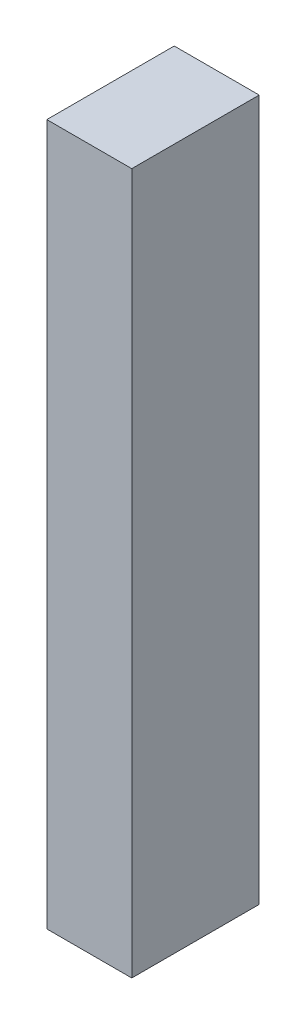
ISO-10303-21;
HEADER;
FILE_DESCRIPTION(('STEP AP214'),'2;1');
FILE_NAME('part.step','',(''),(''),'','','');
FILE_SCHEMA(('AUTOMOTIVE_DESIGN { 1 0 10303 214 1 1 1 1 }'));
ENDSEC;
DATA;
#1=APPLICATION_CONTEXT('core data for automotive mechanical design processes');
#2=APPLICATION_PROTOCOL_DEFINITION('international standard','automotive_design',2000,#1);
#3=PRODUCT_CONTEXT('',#1,'mechanical');
#4=PRODUCT('Part','Part','',(#3));
#5=PRODUCT_RELATED_PRODUCT_CATEGORY('part','',(#4));
#6=PRODUCT_DEFINITION_FORMATION('','',#4);
#7=PRODUCT_DEFINITION_CONTEXT('part definition',#1,'design');
#8=PRODUCT_DEFINITION('design','',#6,#7);
#9=PRODUCT_DEFINITION_SHAPE('','',#8);
#10=(LENGTH_UNIT() NAMED_UNIT(*) SI_UNIT(.MILLI.,.METRE.));
#11=(NAMED_UNIT(*) PLANE_ANGLE_UNIT() SI_UNIT($,.RADIAN.));
#12=(NAMED_UNIT(*) SI_UNIT($,.STERADIAN.) SOLID_ANGLE_UNIT());
#13=UNCERTAINTY_MEASURE_WITH_UNIT(LENGTH_MEASURE(1.E-05),#10,'distance_accuracy_value','');
#14=(GEOMETRIC_REPRESENTATION_CONTEXT(3) GLOBAL_UNCERTAINTY_ASSIGNED_CONTEXT((#13)) GLOBAL_UNIT_ASSIGNED_CONTEXT((#10,
#11,#12)) REPRESENTATION_CONTEXT('',''));
#15=CARTESIAN_POINT('',(0.,0.,0.));
#16=DIRECTION('',(0.,0.,1.));
#17=DIRECTION('',(1.,0.,0.));
#18=AXIS2_PLACEMENT_3D('',#15,#16,#17);
#19=CARTESIAN_POINT('',(25.4,419.1,-38.1));
#20=DIRECTION('',(-1.,0.,0.));
#21=DIRECTION('',(0.,0.,1.));
#22=AXIS2_PLACEMENT_3D('',#19,#20,#21);
#23=PLANE('',#22);
#24=DIRECTION('',(0.,0.,-1.));
#25=VECTOR('',#24,1.);
#26=CARTESIAN_POINT('',(25.4,0.,-38.1));
#27=LINE('',#26,#25);
#28=CARTESIAN_POINT('',(25.4,0.,38.1));
#29=VERTEX_POINT('',#28);
#30=CARTESIAN_POINT('',(25.4,0.,-38.1));
#31=VERTEX_POINT('',#30);
#32=EDGE_CURVE('E107',#29,#31,#27,.T.);
#33=ORIENTED_EDGE('',*,*,#32,.T.);
#34=DIRECTION('',(0.,-1.,0.));
#35=VECTOR('',#34,1.);
#36=CARTESIAN_POINT('',(25.4,419.1,-38.1));
#37=LINE('',#36,#35);
#38=CARTESIAN_POINT('',(25.4,419.1,-38.1));
#39=VERTEX_POINT('',#38);
#40=EDGE_CURVE('E11',#39,#31,#37,.T.);
#41=ORIENTED_EDGE('',*,*,#40,.F.);
#42=DIRECTION('',(0.,0.,-1.));
#43=VECTOR('',#42,1.);
#44=CARTESIAN_POINT('',(25.4,419.1,-38.1));
#45=LINE('',#44,#43);
#46=CARTESIAN_POINT('',(25.4,419.1,38.1));
#47=VERTEX_POINT('',#46);
#48=EDGE_CURVE('E91',#47,#39,#45,.T.);
#49=ORIENTED_EDGE('',*,*,#48,.F.);
#50=DIRECTION('',(0.,-1.,0.));
#51=VECTOR('',#50,1.);
#52=CARTESIAN_POINT('',(25.4,419.1,38.1));
#53=LINE('',#52,#51);
#54=EDGE_CURVE('E103',#47,#29,#53,.T.);
#55=ORIENTED_EDGE('',*,*,#54,.T.);
#56=EDGE_LOOP('',(#33,#41,#49,#55));
#57=FACE_BOUND('',#56,.T.);
#58=ADVANCED_FACE('F39',(#57),#23,.F.);
#59=CARTESIAN_POINT('',(-25.4,419.1,-38.1));
#60=DIRECTION('',(0.,0.,1.));
#61=DIRECTION('',(1.,0.,0.));
#62=AXIS2_PLACEMENT_3D('',#59,#60,#61);
#63=PLANE('',#62);
#64=DIRECTION('',(-1.,0.,0.));
#65=VECTOR('',#64,1.);
#66=CARTESIAN_POINT('',(-25.4,0.,-38.1));
#67=LINE('',#66,#65);
#68=CARTESIAN_POINT('',(-25.4,0.,-38.1));
#69=VERTEX_POINT('',#68);
#70=EDGE_CURVE('E96',#31,#69,#67,.T.);
#71=ORIENTED_EDGE('',*,*,#70,.T.);
#72=DIRECTION('',(0.,-1.,0.));
#73=VECTOR('',#72,1.);
#74=CARTESIAN_POINT('',(-25.4,419.1,-38.1));
#75=LINE('',#74,#73);
#76=CARTESIAN_POINT('',(-25.4,419.1,-38.1));
#77=VERTEX_POINT('',#76);
#78=EDGE_CURVE('E48',#77,#69,#75,.T.);
#79=ORIENTED_EDGE('',*,*,#78,.F.);
#80=DIRECTION('',(-1.,0.,0.));
#81=VECTOR('',#80,1.);
#82=CARTESIAN_POINT('',(-25.4,419.1,-38.1));
#83=LINE('',#82,#81);
#84=EDGE_CURVE('E86',#39,#77,#83,.T.);
#85=ORIENTED_EDGE('',*,*,#84,.F.);
#86=ORIENTED_EDGE('',*,*,#40,.T.);
#87=EDGE_LOOP('',(#71,#79,#85,#86));
#88=FACE_BOUND('',#87,.T.);
#89=ADVANCED_FACE('F95',(#88),#63,.F.);
#90=CARTESIAN_POINT('',(-25.4,419.1,-38.1));
#91=DIRECTION('',(1.,0.,0.));
#92=DIRECTION('',(0.,0.,-1.));
#93=AXIS2_PLACEMENT_3D('',#90,#91,#92);
#94=PLANE('',#93);
#95=DIRECTION('',(0.,0.,1.));
#96=VECTOR('',#95,1.);
#97=CARTESIAN_POINT('',(-25.4,0.,-38.1));
#98=LINE('',#97,#96);
#99=CARTESIAN_POINT('',(-25.4,0.,38.1));
#100=VERTEX_POINT('',#99);
#101=EDGE_CURVE('E73',#69,#100,#98,.T.);
#102=ORIENTED_EDGE('',*,*,#101,.T.);
#103=DIRECTION('',(0.,-1.,0.));
#104=VECTOR('',#103,1.);
#105=CARTESIAN_POINT('',(-25.4,419.1,38.1));
#106=LINE('',#105,#104);
#107=CARTESIAN_POINT('',(-25.4,419.1,38.1));
#108=VERTEX_POINT('',#107);
#109=EDGE_CURVE('E98',#108,#100,#106,.T.);
#110=ORIENTED_EDGE('',*,*,#109,.F.);
#111=DIRECTION('',(0.,0.,1.));
#112=VECTOR('',#111,1.);
#113=CARTESIAN_POINT('',(-25.4,419.1,-38.1));
#114=LINE('',#113,#112);
#115=EDGE_CURVE('E89',#77,#108,#114,.T.);
#116=ORIENTED_EDGE('',*,*,#115,.F.);
#117=ORIENTED_EDGE('',*,*,#78,.T.);
#118=EDGE_LOOP('',(#102,#110,#116,#117));
#119=FACE_BOUND('',#118,.T.);
#120=ADVANCED_FACE('F99',(#119),#94,.F.);
#121=CARTESIAN_POINT('',(-25.4,419.1,38.1));
#122=DIRECTION('',(0.,0.,-1.));
#123=DIRECTION('',(-1.,0.,0.));
#124=AXIS2_PLACEMENT_3D('',#121,#122,#123);
#125=PLANE('',#124);
#126=DIRECTION('',(1.,0.,0.));
#127=VECTOR('',#126,1.);
#128=CARTESIAN_POINT('',(-25.4,0.,38.1));
#129=LINE('',#128,#127);
#130=EDGE_CURVE('E79',#100,#29,#129,.T.);
#131=ORIENTED_EDGE('',*,*,#130,.T.);
#132=ORIENTED_EDGE('',*,*,#54,.F.);
#133=DIRECTION('',(1.,0.,0.));
#134=VECTOR('',#133,1.);
#135=CARTESIAN_POINT('',(-25.4,419.1,38.1));
#136=LINE('',#135,#134);
#137=EDGE_CURVE('E56',#108,#47,#136,.T.);
#138=ORIENTED_EDGE('',*,*,#137,.F.);
#139=ORIENTED_EDGE('',*,*,#109,.T.);
#140=EDGE_LOOP('',(#131,#132,#138,#139));
#141=FACE_BOUND('',#140,.T.);
#142=ADVANCED_FACE('F120',(#141),#125,.F.);
#143=CARTESIAN_POINT('',(0.,419.1,0.));
#144=DIRECTION('',(0.,1.,0.));
#145=DIRECTION('',(0.,0.,1.));
#146=AXIS2_PLACEMENT_3D('',#143,#144,#145);
#147=PLANE('',#146);
#148=ORIENTED_EDGE('',*,*,#48,.T.);
#149=ORIENTED_EDGE('',*,*,#84,.T.);
#150=ORIENTED_EDGE('',*,*,#115,.T.);
#151=ORIENTED_EDGE('',*,*,#137,.T.);
#152=EDGE_LOOP('',(#148,#149,#150,#151));
#153=FACE_BOUND('',#152,.T.);
#154=ADVANCED_FACE('F87',(#153),#147,.T.);
#155=CARTESIAN_POINT('',(0.,0.,0.));
#156=DIRECTION('',(0.,1.,0.));
#157=DIRECTION('',(0.,0.,1.));
#158=AXIS2_PLACEMENT_3D('',#155,#156,#157);
#159=PLANE('',#158);
#160=ORIENTED_EDGE('',*,*,#32,.F.);
#161=ORIENTED_EDGE('',*,*,#130,.F.);
#162=ORIENTED_EDGE('',*,*,#101,.F.);
#163=ORIENTED_EDGE('',*,*,#70,.F.);
#164=EDGE_LOOP('',(#160,#161,#162,#163));
#165=FACE_BOUND('',#164,.T.);
#166=ADVANCED_FACE('F123',(#165),#159,.F.);
#167=CLOSED_SHELL('',(#58,#89,#120,#142,#154,#166));
#168=MANIFOLD_SOLID_BREP('B2',#167);
#169=ADVANCED_BREP_SHAPE_REPRESENTATION('',(#18,#168),#14);
#170=SHAPE_DEFINITION_REPRESENTATION(#9,#169);
ENDSEC;
END-ISO-10303-21;
